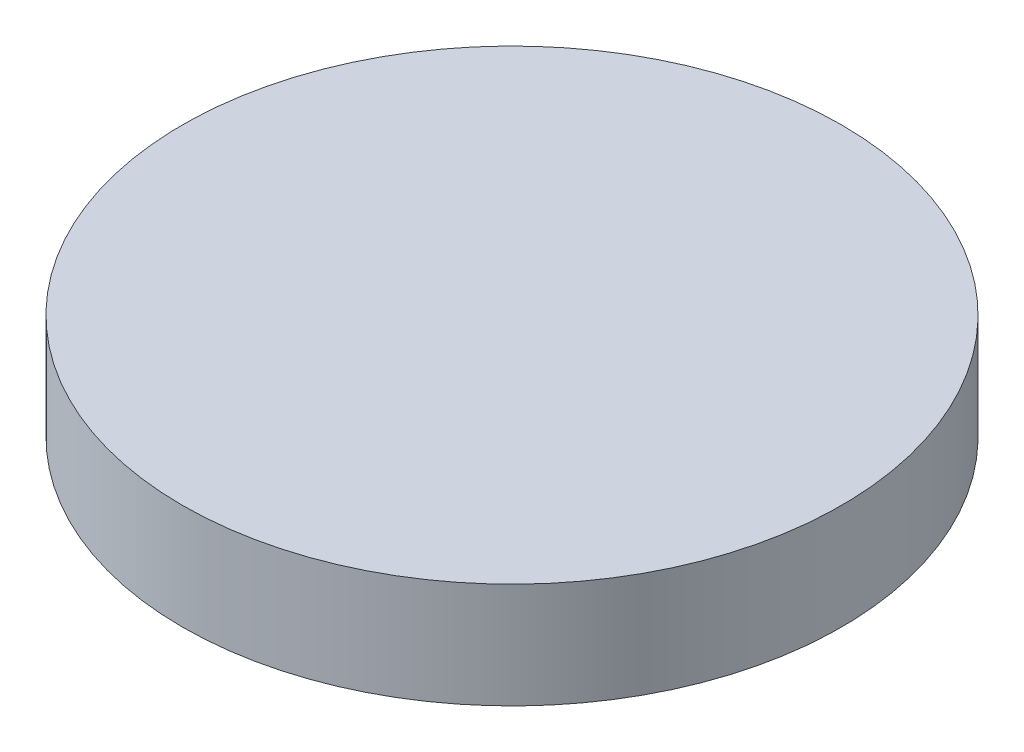
ISO-10303-21;
HEADER;
FILE_DESCRIPTION(('STEP AP214'),'2;1');
FILE_NAME('part.step','',(''),(''),'','','');
FILE_SCHEMA(('AUTOMOTIVE_DESIGN { 1 0 10303 214 1 1 1 1 }'));
ENDSEC;
DATA;
#1=APPLICATION_CONTEXT('core data for automotive mechanical design processes');
#2=APPLICATION_PROTOCOL_DEFINITION('international standard','automotive_design',2000,#1);
#3=PRODUCT_CONTEXT('',#1,'mechanical');
#4=PRODUCT('Part','Part','',(#3));
#5=PRODUCT_RELATED_PRODUCT_CATEGORY('part','',(#4));
#6=PRODUCT_DEFINITION_FORMATION('','',#4);
#7=PRODUCT_DEFINITION_CONTEXT('part definition',#1,'design');
#8=PRODUCT_DEFINITION('design','',#6,#7);
#9=PRODUCT_DEFINITION_SHAPE('','',#8);
#10=(LENGTH_UNIT() NAMED_UNIT(*) SI_UNIT(.MILLI.,.METRE.));
#11=(NAMED_UNIT(*) PLANE_ANGLE_UNIT() SI_UNIT($,.RADIAN.));
#12=(NAMED_UNIT(*) SI_UNIT($,.STERADIAN.) SOLID_ANGLE_UNIT());
#13=UNCERTAINTY_MEASURE_WITH_UNIT(LENGTH_MEASURE(1.E-05),#10,'distance_accuracy_value','');
#14=(GEOMETRIC_REPRESENTATION_CONTEXT(3) GLOBAL_UNCERTAINTY_ASSIGNED_CONTEXT((#13)) GLOBAL_UNIT_ASSIGNED_CONTEXT((#10,
#11,#12)) REPRESENTATION_CONTEXT('',''));
#15=CARTESIAN_POINT('',(0.,0.,0.));
#16=DIRECTION('',(0.,0.,1.));
#17=DIRECTION('',(1.,0.,0.));
#18=AXIS2_PLACEMENT_3D('',#15,#16,#17);
#19=CARTESIAN_POINT('',(0.,8.128,0.));
#20=DIRECTION('',(0.,-1.,0.));
#21=DIRECTION('',(0.,0.,-1.));
#22=AXIS2_PLACEMENT_3D('',#19,#20,#21);
#23=CYLINDRICAL_SURFACE('',#22,25.4);
#24=CARTESIAN_POINT('',(0.,8.128,0.));
#25=DIRECTION('',(0.,1.,0.));
#26=DIRECTION('',(0.,0.,1.));
#27=AXIS2_PLACEMENT_3D('',#24,#25,#26);
#28=CIRCLE('',#27,25.4);
#29=CARTESIAN_POINT('',(0.,8.128,25.4));
#30=VERTEX_POINT('',#29);
#31=EDGE_CURVE('E10',#30,#30,#28,.T.);
#32=ORIENTED_EDGE('',*,*,#31,.F.);
#33=EDGE_LOOP('',(#32));
#34=FACE_BOUND('',#33,.T.);
#35=CARTESIAN_POINT('',(0.,0.,0.));
#36=DIRECTION('',(0.,1.,0.));
#37=DIRECTION('',(0.,0.,1.));
#38=AXIS2_PLACEMENT_3D('',#35,#36,#37);
#39=CIRCLE('',#38,25.4);
#40=CARTESIAN_POINT('',(0.,0.,25.4));
#41=VERTEX_POINT('',#40);
#42=EDGE_CURVE('E40',#41,#41,#39,.T.);
#43=ORIENTED_EDGE('',*,*,#42,.T.);
#44=EDGE_LOOP('',(#43));
#45=FACE_BOUND('',#44,.T.);
#46=ADVANCED_FACE('F37',(#34,#45),#23,.T.);
#47=CARTESIAN_POINT('',(0.,8.128,0.));
#48=DIRECTION('',(0.,1.,0.));
#49=DIRECTION('',(0.,0.,1.));
#50=AXIS2_PLACEMENT_3D('',#47,#48,#49);
#51=PLANE('',#50);
#52=ORIENTED_EDGE('',*,*,#31,.T.);
#53=EDGE_LOOP('',(#52));
#54=FACE_BOUND('',#53,.T.);
#55=ADVANCED_FACE('F54',(#54),#51,.T.);
#56=CARTESIAN_POINT('',(0.,0.,0.));
#57=DIRECTION('',(0.,1.,0.));
#58=DIRECTION('',(0.,0.,1.));
#59=AXIS2_PLACEMENT_3D('',#56,#57,#58);
#60=PLANE('',#59);
#61=ORIENTED_EDGE('',*,*,#42,.F.);
#62=EDGE_LOOP('',(#61));
#63=FACE_BOUND('',#62,.T.);
#64=ADVANCED_FACE('F52',(#63),#60,.F.);
#65=CLOSED_SHELL('',(#46,#55,#64));
#66=MANIFOLD_SOLID_BREP('B2',#65);
#67=ADVANCED_BREP_SHAPE_REPRESENTATION('',(#18,#66),#14);
#68=SHAPE_DEFINITION_REPRESENTATION(#9,#67);
ENDSEC;
END-ISO-10303-21;
